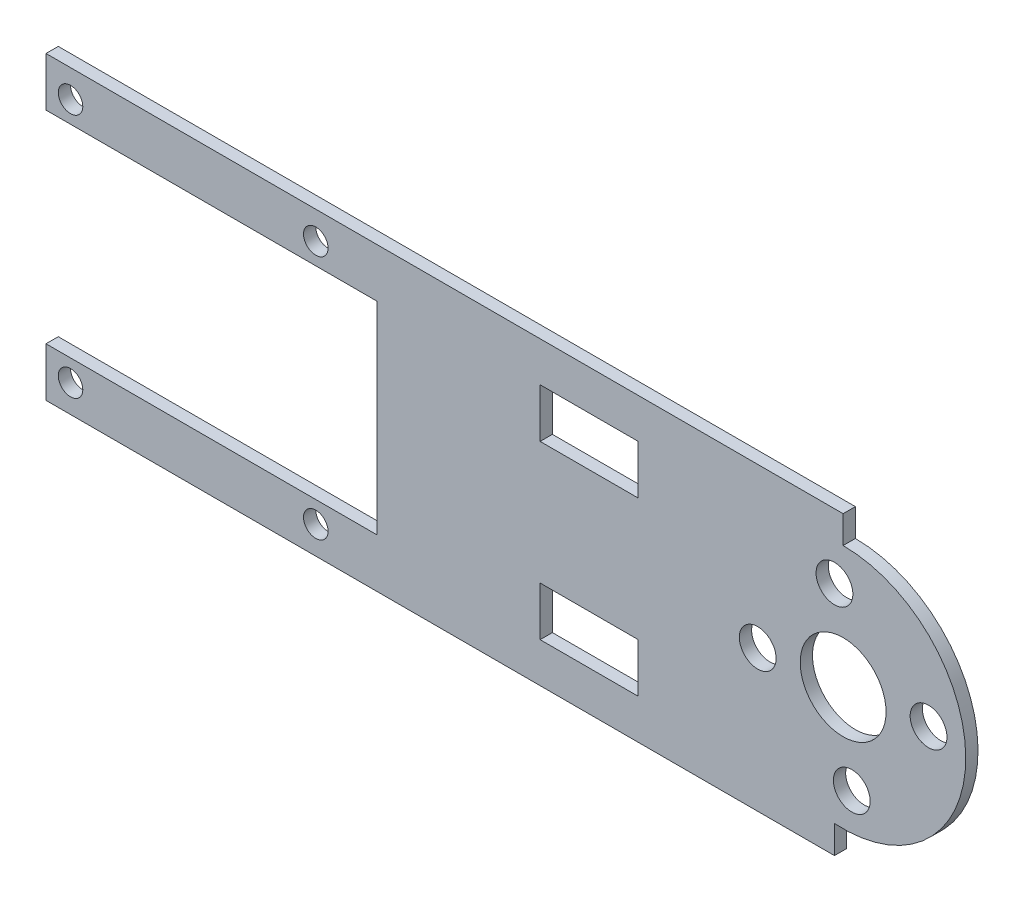
ISO-10303-21;
HEADER;
FILE_DESCRIPTION(('STEP AP214'),'2;1');
FILE_NAME('part.step','',(''),(''),'','','');
FILE_SCHEMA(('AUTOMOTIVE_DESIGN { 1 0 10303 214 1 1 1 1 }'));
ENDSEC;
DATA;
#1=APPLICATION_CONTEXT('core data for automotive mechanical design processes');
#2=APPLICATION_PROTOCOL_DEFINITION('international standard','automotive_design',2000,#1);
#3=PRODUCT_CONTEXT('',#1,'mechanical');
#4=PRODUCT('Part','Part','',(#3));
#5=PRODUCT_RELATED_PRODUCT_CATEGORY('part','',(#4));
#6=PRODUCT_DEFINITION_FORMATION('','',#4);
#7=PRODUCT_DEFINITION_CONTEXT('part definition',#1,'design');
#8=PRODUCT_DEFINITION('design','',#6,#7);
#9=PRODUCT_DEFINITION_SHAPE('','',#8);
#10=(LENGTH_UNIT() NAMED_UNIT(*) SI_UNIT(.MILLI.,.METRE.));
#11=(NAMED_UNIT(*) PLANE_ANGLE_UNIT() SI_UNIT($,.RADIAN.));
#12=(NAMED_UNIT(*) SI_UNIT($,.STERADIAN.) SOLID_ANGLE_UNIT());
#13=UNCERTAINTY_MEASURE_WITH_UNIT(LENGTH_MEASURE(1.E-05),#10,'distance_accuracy_value','');
#14=(GEOMETRIC_REPRESENTATION_CONTEXT(3) GLOBAL_UNCERTAINTY_ASSIGNED_CONTEXT((#13)) GLOBAL_UNIT_ASSIGNED_CONTEXT((#10,
#11,#12)) REPRESENTATION_CONTEXT('',''));
#15=CARTESIAN_POINT('',(0.,0.,0.));
#16=DIRECTION('',(0.,0.,1.));
#17=DIRECTION('',(1.,0.,0.));
#18=AXIS2_PLACEMENT_3D('',#15,#16,#17);
#19=CARTESIAN_POINT('',(40.873321990121,0.,1.));
#20=DIRECTION('',(0.,0.,1.));
#21=DIRECTION('',(1.,0.,0.));
#22=AXIS2_PLACEMENT_3D('',#19,#20,#21);
#23=PLANE('',#22);
#24=CARTESIAN_POINT('',(41.5802048961463,-6.96421686603521,1.));
#25=DIRECTION('',(0.,0.,1.));
#26=DIRECTION('',(1.,0.,0.));
#27=AXIS2_PLACEMENT_3D('',#24,#25,#26);
#28=CIRCLE('',#27,1.5);
#29=CARTESIAN_POINT('',(43.0802048961463,-6.96421686603521,1.));
#30=VERTEX_POINT('',#29);
#31=EDGE_CURVE('E230',#30,#30,#28,.T.);
#32=ORIENTED_EDGE('',*,*,#31,.F.);
#33=EDGE_LOOP('',(#32));
#34=FACE_BOUND('',#33,.T.);
#35=DIRECTION('',(-1.,0.,0.));
#36=VECTOR('',#35,1.);
#37=CARTESIAN_POINT('',(16.1664710949383,9.,1.));
#38=LINE('',#37,#36);
#39=CARTESIAN_POINT('',(24.1664710949383,9.,1.));
#40=VERTEX_POINT('',#39);
#41=CARTESIAN_POINT('',(16.1664710949383,9.,1.));
#42=VERTEX_POINT('',#41);
#43=EDGE_CURVE('E246',#40,#42,#38,.T.);
#44=ORIENTED_EDGE('',*,*,#43,.F.);
#45=DIRECTION('',(0.,1.,0.));
#46=VECTOR('',#45,1.);
#47=CARTESIAN_POINT('',(24.1664710949383,9.,1.));
#48=LINE('',#47,#46);
#49=CARTESIAN_POINT('',(24.1664710949383,5.,1.));
#50=VERTEX_POINT('',#49);
#51=EDGE_CURVE('E244',#50,#40,#48,.T.);
#52=ORIENTED_EDGE('',*,*,#51,.F.);
#53=DIRECTION('',(1.,0.,0.));
#54=VECTOR('',#53,1.);
#55=CARTESIAN_POINT('',(16.1664710949383,5.,1.));
#56=LINE('',#55,#54);
#57=CARTESIAN_POINT('',(16.1664710949383,5.,1.));
#58=VERTEX_POINT('',#57);
#59=EDGE_CURVE('E255',#58,#50,#56,.T.);
#60=ORIENTED_EDGE('',*,*,#59,.F.);
#61=DIRECTION('',(0.,-1.,0.));
#62=VECTOR('',#61,1.);
#63=CARTESIAN_POINT('',(16.1664710949383,9.,1.));
#64=LINE('',#63,#62);
#65=EDGE_CURVE('E249',#42,#58,#64,.T.);
#66=ORIENTED_EDGE('',*,*,#65,.F.);
#67=EDGE_LOOP('',(#44,#52,#60,#66));
#68=FACE_BOUND('',#67,.T.);
#69=CARTESIAN_POINT('',(40.1664390840958,6.96421686603521,1.));
#70=DIRECTION('',(0.,0.,1.));
#71=DIRECTION('',(1.,0.,0.));
#72=AXIS2_PLACEMENT_3D('',#69,#70,#71);
#73=CIRCLE('',#72,1.5);
#74=CARTESIAN_POINT('',(41.6664390840958,6.96421686603521,1.));
#75=VERTEX_POINT('',#74);
#76=EDGE_CURVE('E286',#75,#75,#73,.T.);
#77=ORIENTED_EDGE('',*,*,#76,.F.);
#78=EDGE_LOOP('',(#77));
#79=FACE_BOUND('',#78,.T.);
#80=CARTESIAN_POINT('',(-22.126678009879,-10.,1.));
#81=DIRECTION('',(0.,0.,1.));
#82=DIRECTION('',(1.,0.,0.));
#83=AXIS2_PLACEMENT_3D('',#80,#81,#82);
#84=CIRCLE('',#83,0.999999999999998);
#85=CARTESIAN_POINT('',(-21.126678009879,-10.,1.));
#86=VERTEX_POINT('',#85);
#87=EDGE_CURVE('E305',#86,#86,#84,.T.);
#88=ORIENTED_EDGE('',*,*,#87,.F.);
#89=EDGE_LOOP('',(#88));
#90=FACE_BOUND('',#89,.T.);
#91=CARTESIAN_POINT('',(-2.12667800987896,-10.,1.));
#92=DIRECTION('',(0.,0.,1.));
#93=DIRECTION('',(1.,0.,0.));
#94=AXIS2_PLACEMENT_3D('',#91,#92,#93);
#95=CIRCLE('',#94,1.);
#96=CARTESIAN_POINT('',(-1.12667800987896,-10.,1.));
#97=VERTEX_POINT('',#96);
#98=EDGE_CURVE('E318',#97,#97,#95,.T.);
#99=ORIENTED_EDGE('',*,*,#98,.F.);
#100=EDGE_LOOP('',(#99));
#101=FACE_BOUND('',#100,.T.);
#102=DIRECTION('',(1.,0.,0.));
#103=VECTOR('',#102,1.);
#104=CARTESIAN_POINT('',(40.1664710949383,-12.25,1.));
#105=LINE('',#104,#103);
#106=CARTESIAN_POINT('',(-24.126678009879,-12.25,1.));
#107=VERTEX_POINT('',#106);
#108=CARTESIAN_POINT('',(40.1664710949383,-12.25,1.));
#109=VERTEX_POINT('',#108);
#110=EDGE_CURVE('E331',#107,#109,#105,.T.);
#111=ORIENTED_EDGE('',*,*,#110,.T.);
#112=DIRECTION('',(0.,1.,0.));
#113=VECTOR('',#112,1.);
#114=CARTESIAN_POINT('',(40.1664710949383,-9.97498680760929,1.));
#115=LINE('',#114,#113);
#116=CARTESIAN_POINT('',(40.1664710949383,-9.97498680760929,1.));
#117=VERTEX_POINT('',#116);
#118=EDGE_CURVE('E339',#109,#117,#115,.T.);
#119=ORIENTED_EDGE('',*,*,#118,.T.);
#120=CARTESIAN_POINT('',(40.873321990121,0.,1.));
#121=DIRECTION('',(0.,0.,1.));
#122=DIRECTION('',(1.,0.,0.));
#123=AXIS2_PLACEMENT_3D('',#120,#121,#122);
#124=CIRCLE('',#123,10.);
#125=CARTESIAN_POINT('',(40.873321990121,10.,1.));
#126=VERTEX_POINT('',#125);
#127=EDGE_CURVE('E345',#117,#126,#124,.T.);
#128=ORIENTED_EDGE('',*,*,#127,.T.);
#129=DIRECTION('',(0.,1.,0.));
#130=VECTOR('',#129,1.);
#131=CARTESIAN_POINT('',(40.873321990121,12.25,1.));
#132=LINE('',#131,#130);
#133=CARTESIAN_POINT('',(40.873321990121,12.25,1.));
#134=VERTEX_POINT('',#133);
#135=EDGE_CURVE('E344',#126,#134,#132,.T.);
#136=ORIENTED_EDGE('',*,*,#135,.T.);
#137=DIRECTION('',(-1.,0.,0.));
#138=VECTOR('',#137,1.);
#139=CARTESIAN_POINT('',(5.87332199012103,12.25,1.));
#140=LINE('',#139,#138);
#141=CARTESIAN_POINT('',(-24.126678009879,12.25,1.));
#142=VERTEX_POINT('',#141);
#143=EDGE_CURVE('E346',#134,#142,#140,.T.);
#144=ORIENTED_EDGE('',*,*,#143,.T.);
#145=DIRECTION('',(0.,-1.,0.));
#146=VECTOR('',#145,1.);
#147=CARTESIAN_POINT('',(-24.126678009879,12.25,1.));
#148=LINE('',#147,#146);
#149=CARTESIAN_POINT('',(-24.126678009879,8.25,1.));
#150=VERTEX_POINT('',#149);
#151=EDGE_CURVE('E352',#142,#150,#148,.T.);
#152=ORIENTED_EDGE('',*,*,#151,.T.);
#153=DIRECTION('',(1.,0.,0.));
#154=VECTOR('',#153,1.);
#155=CARTESIAN_POINT('',(-24.126678009879,8.25,1.));
#156=LINE('',#155,#154);
#157=CARTESIAN_POINT('',(2.87332199012104,8.25,1.));
#158=VERTEX_POINT('',#157);
#159=EDGE_CURVE('E351',#150,#158,#156,.T.);
#160=ORIENTED_EDGE('',*,*,#159,.T.);
#161=DIRECTION('',(0.,-1.,0.));
#162=VECTOR('',#161,1.);
#163=CARTESIAN_POINT('',(2.87332199012104,8.25,1.));
#164=LINE('',#163,#162);
#165=CARTESIAN_POINT('',(2.87332199012104,-8.25,1.));
#166=VERTEX_POINT('',#165);
#167=EDGE_CURVE('E360',#158,#166,#164,.T.);
#168=ORIENTED_EDGE('',*,*,#167,.T.);
#169=DIRECTION('',(-1.,0.,0.));
#170=VECTOR('',#169,1.);
#171=CARTESIAN_POINT('',(2.87332199012104,-8.25,1.));
#172=LINE('',#171,#170);
#173=CARTESIAN_POINT('',(-24.126678009879,-8.25000000000001,1.));
#174=VERTEX_POINT('',#173);
#175=EDGE_CURVE('E359',#166,#174,#172,.T.);
#176=ORIENTED_EDGE('',*,*,#175,.T.);
#177=DIRECTION('',(0.,-1.,0.));
#178=VECTOR('',#177,1.);
#179=CARTESIAN_POINT('',(-24.126678009879,-8.25000000000001,1.));
#180=LINE('',#179,#178);
#181=EDGE_CURVE('E361',#174,#107,#180,.T.);
#182=ORIENTED_EDGE('',*,*,#181,.T.);
#183=EDGE_LOOP('',(#111,#119,#128,#136,#144,#152,#160,#168,#176,#182));
#184=FACE_BOUND('',#183,.T.);
#185=CARTESIAN_POINT('',(-2.12667800987896,10.,1.));
#186=DIRECTION('',(0.,0.,1.));
#187=DIRECTION('',(1.,0.,0.));
#188=AXIS2_PLACEMENT_3D('',#185,#186,#187);
#189=CIRCLE('',#188,1.);
#190=CARTESIAN_POINT('',(-1.12667800987896,10.,1.));
#191=VERTEX_POINT('',#190);
#192=EDGE_CURVE('E326',#191,#191,#189,.T.);
#193=ORIENTED_EDGE('',*,*,#192,.F.);
#194=EDGE_LOOP('',(#193));
#195=FACE_BOUND('',#194,.T.);
#196=CARTESIAN_POINT('',(-22.126678009879,10.,1.));
#197=DIRECTION('',(0.,0.,1.));
#198=DIRECTION('',(1.,0.,0.));
#199=AXIS2_PLACEMENT_3D('',#196,#197,#198);
#200=CIRCLE('',#199,0.999999999999998);
#201=CARTESIAN_POINT('',(-21.126678009879,10.,1.));
#202=VERTEX_POINT('',#201);
#203=EDGE_CURVE('E309',#202,#202,#200,.T.);
#204=ORIENTED_EDGE('',*,*,#203,.F.);
#205=EDGE_LOOP('',(#204));
#206=FACE_BOUND('',#205,.T.);
#207=CARTESIAN_POINT('',(40.873321990121,0.,1.));
#208=DIRECTION('',(0.,0.,1.));
#209=DIRECTION('',(1.,0.,0.));
#210=AXIS2_PLACEMENT_3D('',#207,#208,#209);
#211=CIRCLE('',#210,3.5);
#212=CARTESIAN_POINT('',(44.373321990121,0.,1.));
#213=VERTEX_POINT('',#212);
#214=EDGE_CURVE('E294',#213,#213,#211,.T.);
#215=ORIENTED_EDGE('',*,*,#214,.F.);
#216=EDGE_LOOP('',(#215));
#217=FACE_BOUND('',#216,.T.);
#218=CARTESIAN_POINT('',(47.8375388561562,0.706882906025226,1.));
#219=DIRECTION('',(0.,0.,1.));
#220=DIRECTION('',(1.,0.,0.));
#221=AXIS2_PLACEMENT_3D('',#218,#219,#220);
#222=CIRCLE('',#221,1.5);
#223=CARTESIAN_POINT('',(49.3375388561562,0.706882906025226,1.));
#224=VERTEX_POINT('',#223);
#225=EDGE_CURVE('E234',#224,#224,#222,.T.);
#226=ORIENTED_EDGE('',*,*,#225,.F.);
#227=EDGE_LOOP('',(#226));
#228=FACE_BOUND('',#227,.T.);
#229=CARTESIAN_POINT('',(33.9091051240858,-0.706882906025225,1.));
#230=DIRECTION('',(0.,0.,1.));
#231=DIRECTION('',(1.,0.,0.));
#232=AXIS2_PLACEMENT_3D('',#229,#230,#231);
#233=CIRCLE('',#232,1.5);
#234=CARTESIAN_POINT('',(35.4091051240858,-0.706882906025225,1.));
#235=VERTEX_POINT('',#234);
#236=EDGE_CURVE('E218',#235,#235,#233,.T.);
#237=ORIENTED_EDGE('',*,*,#236,.F.);
#238=EDGE_LOOP('',(#237));
#239=FACE_BOUND('',#238,.T.);
#240=DIRECTION('',(-1.,0.,0.));
#241=VECTOR('',#240,1.);
#242=CARTESIAN_POINT('',(16.1664710949383,-5.,1.));
#243=LINE('',#242,#241);
#244=CARTESIAN_POINT('',(24.1664710949383,-5.,1.));
#245=VERTEX_POINT('',#244);
#246=CARTESIAN_POINT('',(16.1664710949383,-5.,1.));
#247=VERTEX_POINT('',#246);
#248=EDGE_CURVE('E179',#245,#247,#243,.T.);
#249=ORIENTED_EDGE('',*,*,#248,.F.);
#250=DIRECTION('',(0.,1.,0.));
#251=VECTOR('',#250,1.);
#252=CARTESIAN_POINT('',(24.1664710949383,-5.,1.));
#253=LINE('',#252,#251);
#254=CARTESIAN_POINT('',(24.1664710949383,-9.,1.));
#255=VERTEX_POINT('',#254);
#256=EDGE_CURVE('E172',#255,#245,#253,.T.);
#257=ORIENTED_EDGE('',*,*,#256,.F.);
#258=DIRECTION('',(1.,0.,0.));
#259=VECTOR('',#258,1.);
#260=CARTESIAN_POINT('',(16.1664710949383,-9.,1.));
#261=LINE('',#260,#259);
#262=CARTESIAN_POINT('',(16.1664710949383,-9.,1.));
#263=VERTEX_POINT('',#262);
#264=EDGE_CURVE('E197',#263,#255,#261,.T.);
#265=ORIENTED_EDGE('',*,*,#264,.F.);
#266=DIRECTION('',(0.,-1.,0.));
#267=VECTOR('',#266,1.);
#268=CARTESIAN_POINT('',(16.1664710949383,-5.,1.));
#269=LINE('',#268,#267);
#270=EDGE_CURVE('E193',#247,#263,#269,.T.);
#271=ORIENTED_EDGE('',*,*,#270,.F.);
#272=EDGE_LOOP('',(#249,#257,#265,#271));
#273=FACE_BOUND('',#272,.T.);
#274=ADVANCED_FACE('F44',(#34,#68,#79,#90,#101,#184,#195,#206,#217,#228,#239,#273),#23,.T.);
#275=CARTESIAN_POINT('',(40.873321990121,0.,0.));
#276=DIRECTION('',(0.,0.,1.));
#277=DIRECTION('',(1.,0.,0.));
#278=AXIS2_PLACEMENT_3D('',#275,#276,#277);
#279=PLANE('',#278);
#280=CARTESIAN_POINT('',(33.9091051240858,-0.706882906025225,0.));
#281=DIRECTION('',(0.,0.,1.));
#282=DIRECTION('',(1.,0.,0.));
#283=AXIS2_PLACEMENT_3D('',#280,#281,#282);
#284=CIRCLE('',#283,1.5);
#285=CARTESIAN_POINT('',(35.4091051240858,-0.706882906025225,0.));
#286=VERTEX_POINT('',#285);
#287=EDGE_CURVE('E186',#286,#286,#284,.T.);
#288=ORIENTED_EDGE('',*,*,#287,.T.);
#289=EDGE_LOOP('',(#288));
#290=FACE_BOUND('',#289,.T.);
#291=CARTESIAN_POINT('',(41.5802048961463,-6.96421686603521,0.));
#292=DIRECTION('',(0.,0.,1.));
#293=DIRECTION('',(1.,0.,0.));
#294=AXIS2_PLACEMENT_3D('',#291,#292,#293);
#295=CIRCLE('',#294,1.5);
#296=CARTESIAN_POINT('',(43.0802048961463,-6.96421686603521,0.));
#297=VERTEX_POINT('',#296);
#298=EDGE_CURVE('E224',#297,#297,#295,.T.);
#299=ORIENTED_EDGE('',*,*,#298,.T.);
#300=EDGE_LOOP('',(#299));
#301=FACE_BOUND('',#300,.T.);
#302=CARTESIAN_POINT('',(47.8375388561562,0.706882906025226,0.));
#303=DIRECTION('',(0.,0.,1.));
#304=DIRECTION('',(1.,0.,0.));
#305=AXIS2_PLACEMENT_3D('',#302,#303,#304);
#306=CIRCLE('',#305,1.5);
#307=CARTESIAN_POINT('',(49.3375388561562,0.706882906025226,0.));
#308=VERTEX_POINT('',#307);
#309=EDGE_CURVE('E231',#308,#308,#306,.T.);
#310=ORIENTED_EDGE('',*,*,#309,.T.);
#311=EDGE_LOOP('',(#310));
#312=FACE_BOUND('',#311,.T.);
#313=DIRECTION('',(0.,1.,0.));
#314=VECTOR('',#313,1.);
#315=CARTESIAN_POINT('',(24.1664710949383,9.,0.));
#316=LINE('',#315,#314);
#317=CARTESIAN_POINT('',(24.1664710949383,5.,0.));
#318=VERTEX_POINT('',#317);
#319=CARTESIAN_POINT('',(24.1664710949383,9.,0.));
#320=VERTEX_POINT('',#319);
#321=EDGE_CURVE('E239',#318,#320,#316,.T.);
#322=ORIENTED_EDGE('',*,*,#321,.T.);
#323=DIRECTION('',(-1.,0.,0.));
#324=VECTOR('',#323,1.);
#325=CARTESIAN_POINT('',(16.1664710949383,9.,0.));
#326=LINE('',#325,#324);
#327=CARTESIAN_POINT('',(16.1664710949383,9.,0.));
#328=VERTEX_POINT('',#327);
#329=EDGE_CURVE('E261',#320,#328,#326,.T.);
#330=ORIENTED_EDGE('',*,*,#329,.T.);
#331=DIRECTION('',(0.,-1.,0.));
#332=VECTOR('',#331,1.);
#333=CARTESIAN_POINT('',(16.1664710949383,9.,0.));
#334=LINE('',#333,#332);
#335=CARTESIAN_POINT('',(16.1664710949383,5.,0.));
#336=VERTEX_POINT('',#335);
#337=EDGE_CURVE('E264',#328,#336,#334,.T.);
#338=ORIENTED_EDGE('',*,*,#337,.T.);
#339=DIRECTION('',(1.,0.,0.));
#340=VECTOR('',#339,1.);
#341=CARTESIAN_POINT('',(16.1664710949383,5.,0.));
#342=LINE('',#341,#340);
#343=EDGE_CURVE('E250',#336,#318,#342,.T.);
#344=ORIENTED_EDGE('',*,*,#343,.T.);
#345=EDGE_LOOP('',(#322,#330,#338,#344));
#346=FACE_BOUND('',#345,.T.);
#347=DIRECTION('',(0.,1.,0.));
#348=VECTOR('',#347,1.);
#349=CARTESIAN_POINT('',(40.1664710949383,-9.97498680760929,0.));
#350=LINE('',#349,#348);
#351=CARTESIAN_POINT('',(40.1664710949383,-12.25,0.));
#352=VERTEX_POINT('',#351);
#353=CARTESIAN_POINT('',(40.1664710949383,-9.97498680760929,0.));
#354=VERTEX_POINT('',#353);
#355=EDGE_CURVE('E329',#352,#354,#350,.T.);
#356=ORIENTED_EDGE('',*,*,#355,.F.);
#357=DIRECTION('',(1.,0.,0.));
#358=VECTOR('',#357,1.);
#359=CARTESIAN_POINT('',(-4.12667800987897,-12.25,0.));
#360=LINE('',#359,#358);
#361=CARTESIAN_POINT('',(-24.126678009879,-12.25,0.));
#362=VERTEX_POINT('',#361);
#363=EDGE_CURVE('E336',#362,#352,#360,.T.);
#364=ORIENTED_EDGE('',*,*,#363,.F.);
#365=DIRECTION('',(0.,-1.,0.));
#366=VECTOR('',#365,1.);
#367=CARTESIAN_POINT('',(-24.126678009879,-8.25000000000001,0.));
#368=LINE('',#367,#366);
#369=CARTESIAN_POINT('',(-24.126678009879,-8.25000000000001,0.));
#370=VERTEX_POINT('',#369);
#371=EDGE_CURVE('E395',#370,#362,#368,.T.);
#372=ORIENTED_EDGE('',*,*,#371,.F.);
#373=DIRECTION('',(-1.,0.,0.));
#374=VECTOR('',#373,1.);
#375=CARTESIAN_POINT('',(2.87332199012104,-8.25,0.));
#376=LINE('',#375,#374);
#377=CARTESIAN_POINT('',(2.87332199012104,-8.25,0.));
#378=VERTEX_POINT('',#377);
#379=EDGE_CURVE('E386',#378,#370,#376,.T.);
#380=ORIENTED_EDGE('',*,*,#379,.F.);
#381=DIRECTION('',(0.,-1.,0.));
#382=VECTOR('',#381,1.);
#383=CARTESIAN_POINT('',(2.87332199012104,8.25,0.));
#384=LINE('',#383,#382);
#385=CARTESIAN_POINT('',(2.87332199012104,8.25,0.));
#386=VERTEX_POINT('',#385);
#387=EDGE_CURVE('E387',#386,#378,#384,.T.);
#388=ORIENTED_EDGE('',*,*,#387,.F.);
#389=DIRECTION('',(1.,0.,0.));
#390=VECTOR('',#389,1.);
#391=CARTESIAN_POINT('',(-24.126678009879,8.25,0.));
#392=LINE('',#391,#390);
#393=CARTESIAN_POINT('',(-24.126678009879,8.25,0.));
#394=VERTEX_POINT('',#393);
#395=EDGE_CURVE('E382',#394,#386,#392,.T.);
#396=ORIENTED_EDGE('',*,*,#395,.F.);
#397=DIRECTION('',(0.,-1.,0.));
#398=VECTOR('',#397,1.);
#399=CARTESIAN_POINT('',(-24.126678009879,12.25,0.));
#400=LINE('',#399,#398);
#401=CARTESIAN_POINT('',(-24.126678009879,12.25,0.));
#402=VERTEX_POINT('',#401);
#403=EDGE_CURVE('E379',#402,#394,#400,.T.);
#404=ORIENTED_EDGE('',*,*,#403,.F.);
#405=DIRECTION('',(-1.,0.,0.));
#406=VECTOR('',#405,1.);
#407=CARTESIAN_POINT('',(-4.12667800987897,12.25,0.));
#408=LINE('',#407,#406);
#409=CARTESIAN_POINT('',(40.873321990121,12.25,0.));
#410=VERTEX_POINT('',#409);
#411=EDGE_CURVE('E380',#410,#402,#408,.T.);
#412=ORIENTED_EDGE('',*,*,#411,.F.);
#413=DIRECTION('',(0.,1.,0.));
#414=VECTOR('',#413,1.);
#415=CARTESIAN_POINT('',(40.873321990121,12.25,0.));
#416=LINE('',#415,#414);
#417=CARTESIAN_POINT('',(40.873321990121,10.,0.));
#418=VERTEX_POINT('',#417);
#419=EDGE_CURVE('E373',#418,#410,#416,.T.);
#420=ORIENTED_EDGE('',*,*,#419,.F.);
#421=CARTESIAN_POINT('',(40.873321990121,0.,0.));
#422=DIRECTION('',(0.,0.,1.));
#423=DIRECTION('',(1.,0.,0.));
#424=AXIS2_PLACEMENT_3D('',#421,#422,#423);
#425=CIRCLE('',#424,10.);
#426=EDGE_CURVE('E367',#354,#418,#425,.T.);
#427=ORIENTED_EDGE('',*,*,#426,.F.);
#428=EDGE_LOOP('',(#356,#364,#372,#380,#388,#396,#404,#412,#420,#427));
#429=FACE_BOUND('',#428,.T.);
#430=CARTESIAN_POINT('',(-2.12667800987896,10.,0.));
#431=DIRECTION('',(0.,0.,1.));
#432=DIRECTION('',(1.,0.,0.));
#433=AXIS2_PLACEMENT_3D('',#430,#431,#432);
#434=CIRCLE('',#433,1.);
#435=CARTESIAN_POINT('',(-1.12667800987896,10.,0.));
#436=VERTEX_POINT('',#435);
#437=EDGE_CURVE('E325',#436,#436,#434,.T.);
#438=ORIENTED_EDGE('',*,*,#437,.T.);
#439=EDGE_LOOP('',(#438));
#440=FACE_BOUND('',#439,.T.);
#441=CARTESIAN_POINT('',(-2.12667800987896,-10.,0.));
#442=DIRECTION('',(0.,0.,1.));
#443=DIRECTION('',(1.,0.,0.));
#444=AXIS2_PLACEMENT_3D('',#441,#442,#443);
#445=CIRCLE('',#444,1.);
#446=CARTESIAN_POINT('',(-1.12667800987896,-10.,0.));
#447=VERTEX_POINT('',#446);
#448=EDGE_CURVE('E314',#447,#447,#445,.T.);
#449=ORIENTED_EDGE('',*,*,#448,.T.);
#450=EDGE_LOOP('',(#449));
#451=FACE_BOUND('',#450,.T.);
#452=CARTESIAN_POINT('',(-22.126678009879,10.,0.));
#453=DIRECTION('',(0.,0.,1.));
#454=DIRECTION('',(1.,0.,0.));
#455=AXIS2_PLACEMENT_3D('',#452,#453,#454);
#456=CIRCLE('',#455,0.999999999999998);
#457=CARTESIAN_POINT('',(-21.126678009879,10.,0.));
#458=VERTEX_POINT('',#457);
#459=EDGE_CURVE('E308',#458,#458,#456,.T.);
#460=ORIENTED_EDGE('',*,*,#459,.T.);
#461=EDGE_LOOP('',(#460));
#462=FACE_BOUND('',#461,.T.);
#463=CARTESIAN_POINT('',(-22.126678009879,-10.,0.));
#464=DIRECTION('',(0.,0.,1.));
#465=DIRECTION('',(1.,0.,0.));
#466=AXIS2_PLACEMENT_3D('',#463,#464,#465);
#467=CIRCLE('',#466,0.999999999999998);
#468=CARTESIAN_POINT('',(-21.126678009879,-10.,0.));
#469=VERTEX_POINT('',#468);
#470=EDGE_CURVE('E299',#469,#469,#467,.T.);
#471=ORIENTED_EDGE('',*,*,#470,.T.);
#472=EDGE_LOOP('',(#471));
#473=FACE_BOUND('',#472,.T.);
#474=CARTESIAN_POINT('',(40.873321990121,0.,0.));
#475=DIRECTION('',(0.,0.,1.));
#476=DIRECTION('',(1.,0.,0.));
#477=AXIS2_PLACEMENT_3D('',#474,#475,#476);
#478=CIRCLE('',#477,3.5);
#479=CARTESIAN_POINT('',(44.373321990121,0.,0.));
#480=VERTEX_POINT('',#479);
#481=EDGE_CURVE('E289',#480,#480,#478,.T.);
#482=ORIENTED_EDGE('',*,*,#481,.T.);
#483=EDGE_LOOP('',(#482));
#484=FACE_BOUND('',#483,.T.);
#485=CARTESIAN_POINT('',(40.1664390840958,6.96421686603521,0.));
#486=DIRECTION('',(0.,0.,1.));
#487=DIRECTION('',(1.,0.,0.));
#488=AXIS2_PLACEMENT_3D('',#485,#486,#487);
#489=CIRCLE('',#488,1.5);
#490=CARTESIAN_POINT('',(41.6664390840958,6.96421686603521,0.));
#491=VERTEX_POINT('',#490);
#492=EDGE_CURVE('E283',#491,#491,#489,.T.);
#493=ORIENTED_EDGE('',*,*,#492,.T.);
#494=EDGE_LOOP('',(#493));
#495=FACE_BOUND('',#494,.T.);
#496=DIRECTION('',(0.,1.,0.));
#497=VECTOR('',#496,1.);
#498=CARTESIAN_POINT('',(24.1664710949383,-5.,0.));
#499=LINE('',#498,#497);
#500=CARTESIAN_POINT('',(24.1664710949383,-9.,0.));
#501=VERTEX_POINT('',#500);
#502=CARTESIAN_POINT('',(24.1664710949383,-5.,0.));
#503=VERTEX_POINT('',#502);
#504=EDGE_CURVE('E67',#501,#503,#499,.T.);
#505=ORIENTED_EDGE('',*,*,#504,.T.);
#506=DIRECTION('',(-1.,0.,0.));
#507=VECTOR('',#506,1.);
#508=CARTESIAN_POINT('',(16.1664710949383,-5.,0.));
#509=LINE('',#508,#507);
#510=CARTESIAN_POINT('',(16.1664710949383,-5.,0.));
#511=VERTEX_POINT('',#510);
#512=EDGE_CURVE('E190',#503,#511,#509,.T.);
#513=ORIENTED_EDGE('',*,*,#512,.T.);
#514=DIRECTION('',(0.,-1.,0.));
#515=VECTOR('',#514,1.);
#516=CARTESIAN_POINT('',(16.1664710949383,-5.,0.));
#517=LINE('',#516,#515);
#518=CARTESIAN_POINT('',(16.1664710949383,-9.,0.));
#519=VERTEX_POINT('',#518);
#520=EDGE_CURVE('E206',#511,#519,#517,.T.);
#521=ORIENTED_EDGE('',*,*,#520,.T.);
#522=DIRECTION('',(1.,0.,0.));
#523=VECTOR('',#522,1.);
#524=CARTESIAN_POINT('',(16.1664710949383,-9.,0.));
#525=LINE('',#524,#523);
#526=EDGE_CURVE('E182',#519,#501,#525,.T.);
#527=ORIENTED_EDGE('',*,*,#526,.T.);
#528=EDGE_LOOP('',(#505,#513,#521,#527));
#529=FACE_BOUND('',#528,.T.);
#530=ADVANCED_FACE('F439',(#290,#301,#312,#346,#429,#440,#451,#462,#473,#484,#495,#529),#279,.F.);
#531=CARTESIAN_POINT('',(40.1664710949383,-9.97498680760929,1.));
#532=DIRECTION('',(-1.,0.,0.));
#533=DIRECTION('',(0.,-1.,0.));
#534=AXIS2_PLACEMENT_3D('',#531,#532,#533);
#535=PLANE('',#534);
#536=ORIENTED_EDGE('',*,*,#355,.T.);
#537=DIRECTION('',(0.,0.,-1.));
#538=VECTOR('',#537,1.);
#539=CARTESIAN_POINT('',(40.1664710949383,-9.97498680760929,1.));
#540=LINE('',#539,#538);
#541=EDGE_CURVE('E53',#117,#354,#540,.T.);
#542=ORIENTED_EDGE('',*,*,#541,.F.);
#543=ORIENTED_EDGE('',*,*,#118,.F.);
#544=DIRECTION('',(0.,0.,-1.));
#545=VECTOR('',#544,1.);
#546=CARTESIAN_POINT('',(40.1664710949383,-12.25,1.));
#547=LINE('',#546,#545);
#548=EDGE_CURVE('E11',#109,#352,#547,.T.);
#549=ORIENTED_EDGE('',*,*,#548,.T.);
#550=EDGE_LOOP('',(#536,#542,#543,#549));
#551=FACE_BOUND('',#550,.T.);
#552=ADVANCED_FACE('F50',(#551),#535,.F.);
#553=CARTESIAN_POINT('',(40.873321990121,0.,1.));
#554=DIRECTION('',(0.,0.,-1.));
#555=DIRECTION('',(-1.,0.,0.));
#556=AXIS2_PLACEMENT_3D('',#553,#554,#555);
#557=CYLINDRICAL_SURFACE('',#556,10.);
#558=ORIENTED_EDGE('',*,*,#426,.T.);
#559=DIRECTION('',(0.,0.,-1.));
#560=VECTOR('',#559,1.);
#561=CARTESIAN_POINT('',(40.873321990121,10.,1.));
#562=LINE('',#561,#560);
#563=EDGE_CURVE('E422',#126,#418,#562,.T.);
#564=ORIENTED_EDGE('',*,*,#563,.F.);
#565=ORIENTED_EDGE('',*,*,#127,.F.);
#566=ORIENTED_EDGE('',*,*,#541,.T.);
#567=EDGE_LOOP('',(#558,#564,#565,#566));
#568=FACE_BOUND('',#567,.T.);
#569=ADVANCED_FACE('F432',(#568),#557,.T.);
#570=CARTESIAN_POINT('',(40.873321990121,12.25,1.));
#571=DIRECTION('',(-1.,0.,0.));
#572=DIRECTION('',(0.,0.,1.));
#573=AXIS2_PLACEMENT_3D('',#570,#571,#572);
#574=PLANE('',#573);
#575=ORIENTED_EDGE('',*,*,#419,.T.);
#576=DIRECTION('',(0.,0.,-1.));
#577=VECTOR('',#576,1.);
#578=CARTESIAN_POINT('',(40.873321990121,12.25,1.));
#579=LINE('',#578,#577);
#580=EDGE_CURVE('E423',#134,#410,#579,.T.);
#581=ORIENTED_EDGE('',*,*,#580,.F.);
#582=ORIENTED_EDGE('',*,*,#135,.F.);
#583=ORIENTED_EDGE('',*,*,#563,.T.);
#584=EDGE_LOOP('',(#575,#581,#582,#583));
#585=FACE_BOUND('',#584,.T.);
#586=ADVANCED_FACE('F443',(#585),#574,.F.);
#587=CARTESIAN_POINT('',(-4.12667800987897,12.25,1.));
#588=DIRECTION('',(0.,-1.,0.));
#589=DIRECTION('',(1.,0.,0.));
#590=AXIS2_PLACEMENT_3D('',#587,#588,#589);
#591=PLANE('',#590);
#592=ORIENTED_EDGE('',*,*,#411,.T.);
#593=DIRECTION('',(0.,0.,-1.));
#594=VECTOR('',#593,1.);
#595=CARTESIAN_POINT('',(-24.126678009879,12.25,1.));
#596=LINE('',#595,#594);
#597=EDGE_CURVE('E417',#142,#402,#596,.T.);
#598=ORIENTED_EDGE('',*,*,#597,.F.);
#599=ORIENTED_EDGE('',*,*,#143,.F.);
#600=ORIENTED_EDGE('',*,*,#580,.T.);
#601=EDGE_LOOP('',(#592,#598,#599,#600));
#602=FACE_BOUND('',#601,.T.);
#603=ADVANCED_FACE('F446',(#602),#591,.F.);
#604=CARTESIAN_POINT('',(-24.126678009879,12.25,1.));
#605=DIRECTION('',(1.,0.,0.));
#606=DIRECTION('',(0.,0.,-1.));
#607=AXIS2_PLACEMENT_3D('',#604,#605,#606);
#608=PLANE('',#607);
#609=ORIENTED_EDGE('',*,*,#403,.T.);
#610=DIRECTION('',(0.,0.,-1.));
#611=VECTOR('',#610,1.);
#612=CARTESIAN_POINT('',(-24.126678009879,8.25,1.));
#613=LINE('',#612,#611);
#614=EDGE_CURVE('E413',#150,#394,#613,.T.);
#615=ORIENTED_EDGE('',*,*,#614,.F.);
#616=ORIENTED_EDGE('',*,*,#151,.F.);
#617=ORIENTED_EDGE('',*,*,#597,.T.);
#618=EDGE_LOOP('',(#609,#615,#616,#617));
#619=FACE_BOUND('',#618,.T.);
#620=ADVANCED_FACE('F479',(#619),#608,.F.);
#621=CARTESIAN_POINT('',(-24.126678009879,8.25,1.));
#622=DIRECTION('',(0.,1.,0.));
#623=DIRECTION('',(0.,0.,1.));
#624=AXIS2_PLACEMENT_3D('',#621,#622,#623);
#625=PLANE('',#624);
#626=ORIENTED_EDGE('',*,*,#395,.T.);
#627=DIRECTION('',(0.,0.,-1.));
#628=VECTOR('',#627,1.);
#629=CARTESIAN_POINT('',(2.87332199012104,8.25,1.));
#630=LINE('',#629,#628);
#631=EDGE_CURVE('E406',#158,#386,#630,.T.);
#632=ORIENTED_EDGE('',*,*,#631,.F.);
#633=ORIENTED_EDGE('',*,*,#159,.F.);
#634=ORIENTED_EDGE('',*,*,#614,.T.);
#635=EDGE_LOOP('',(#626,#632,#633,#634));
#636=FACE_BOUND('',#635,.T.);
#637=ADVANCED_FACE('F480',(#636),#625,.F.);
#638=CARTESIAN_POINT('',(2.87332199012104,8.25,1.));
#639=DIRECTION('',(1.,0.,0.));
#640=DIRECTION('',(0.,1.,0.));
#641=AXIS2_PLACEMENT_3D('',#638,#639,#640);
#642=PLANE('',#641);
#643=ORIENTED_EDGE('',*,*,#387,.T.);
#644=DIRECTION('',(0.,0.,-1.));
#645=VECTOR('',#644,1.);
#646=CARTESIAN_POINT('',(2.87332199012104,-8.25,1.));
#647=LINE('',#646,#645);
#648=EDGE_CURVE('E403',#166,#378,#647,.T.);
#649=ORIENTED_EDGE('',*,*,#648,.F.);
#650=ORIENTED_EDGE('',*,*,#167,.F.);
#651=ORIENTED_EDGE('',*,*,#631,.T.);
#652=EDGE_LOOP('',(#643,#649,#650,#651));
#653=FACE_BOUND('',#652,.T.);
#654=ADVANCED_FACE('F472',(#653),#642,.F.);
#655=CARTESIAN_POINT('',(2.87332199012104,-8.25,1.));
#656=DIRECTION('',(0.,-1.,0.));
#657=DIRECTION('',(1.,0.,0.));
#658=AXIS2_PLACEMENT_3D('',#655,#656,#657);
#659=PLANE('',#658);
#660=ORIENTED_EDGE('',*,*,#379,.T.);
#661=DIRECTION('',(0.,0.,-1.));
#662=VECTOR('',#661,1.);
#663=CARTESIAN_POINT('',(-24.126678009879,-8.25000000000001,1.));
#664=LINE('',#663,#662);
#665=EDGE_CURVE('E402',#174,#370,#664,.T.);
#666=ORIENTED_EDGE('',*,*,#665,.F.);
#667=ORIENTED_EDGE('',*,*,#175,.F.);
#668=ORIENTED_EDGE('',*,*,#648,.T.);
#669=EDGE_LOOP('',(#660,#666,#667,#668));
#670=FACE_BOUND('',#669,.T.);
#671=ADVANCED_FACE('F470',(#670),#659,.F.);
#672=CARTESIAN_POINT('',(-24.126678009879,-8.25000000000001,1.));
#673=DIRECTION('',(1.,0.,0.));
#674=DIRECTION('',(0.,0.,-1.));
#675=AXIS2_PLACEMENT_3D('',#672,#673,#674);
#676=PLANE('',#675);
#677=ORIENTED_EDGE('',*,*,#371,.T.);
#678=DIRECTION('',(0.,0.,-1.));
#679=VECTOR('',#678,1.);
#680=CARTESIAN_POINT('',(-24.126678009879,-12.25,1.));
#681=LINE('',#680,#679);
#682=EDGE_CURVE('E370',#107,#362,#681,.T.);
#683=ORIENTED_EDGE('',*,*,#682,.F.);
#684=ORIENTED_EDGE('',*,*,#181,.F.);
#685=ORIENTED_EDGE('',*,*,#665,.T.);
#686=EDGE_LOOP('',(#677,#683,#684,#685));
#687=FACE_BOUND('',#686,.T.);
#688=ADVANCED_FACE('F465',(#687),#676,.F.);
#689=CARTESIAN_POINT('',(-4.12667800987897,-12.25,1.));
#690=DIRECTION('',(0.,1.,0.));
#691=DIRECTION('',(-1.,0.,0.));
#692=AXIS2_PLACEMENT_3D('',#689,#690,#691);
#693=PLANE('',#692);
#694=ORIENTED_EDGE('',*,*,#363,.T.);
#695=ORIENTED_EDGE('',*,*,#548,.F.);
#696=ORIENTED_EDGE('',*,*,#110,.F.);
#697=ORIENTED_EDGE('',*,*,#682,.T.);
#698=EDGE_LOOP('',(#694,#695,#696,#697));
#699=FACE_BOUND('',#698,.T.);
#700=ADVANCED_FACE('F460',(#699),#693,.F.);
#701=CARTESIAN_POINT('',(-2.12667800987896,10.,1.));
#702=DIRECTION('',(0.,0.,-1.));
#703=DIRECTION('',(-1.,0.,0.));
#704=AXIS2_PLACEMENT_3D('',#701,#702,#703);
#705=CYLINDRICAL_SURFACE('',#704,1.);
#706=ORIENTED_EDGE('',*,*,#192,.T.);
#707=EDGE_LOOP('',(#706));
#708=FACE_BOUND('',#707,.T.);
#709=ORIENTED_EDGE('',*,*,#437,.F.);
#710=EDGE_LOOP('',(#709));
#711=FACE_BOUND('',#710,.T.);
#712=ADVANCED_FACE('F496',(#708,#711),#705,.F.);
#713=CARTESIAN_POINT('',(-2.12667800987896,-10.,1.));
#714=DIRECTION('',(0.,0.,-1.));
#715=DIRECTION('',(-1.,0.,0.));
#716=AXIS2_PLACEMENT_3D('',#713,#714,#715);
#717=CYLINDRICAL_SURFACE('',#716,1.);
#718=ORIENTED_EDGE('',*,*,#98,.T.);
#719=EDGE_LOOP('',(#718));
#720=FACE_BOUND('',#719,.T.);
#721=ORIENTED_EDGE('',*,*,#448,.F.);
#722=EDGE_LOOP('',(#721));
#723=FACE_BOUND('',#722,.T.);
#724=ADVANCED_FACE('F536',(#720,#723),#717,.F.);
#725=CARTESIAN_POINT('',(-22.126678009879,10.,1.));
#726=DIRECTION('',(0.,0.,-1.));
#727=DIRECTION('',(-1.,0.,0.));
#728=AXIS2_PLACEMENT_3D('',#725,#726,#727);
#729=CYLINDRICAL_SURFACE('',#728,0.999999999999998);
#730=ORIENTED_EDGE('',*,*,#203,.T.);
#731=EDGE_LOOP('',(#730));
#732=FACE_BOUND('',#731,.T.);
#733=ORIENTED_EDGE('',*,*,#459,.F.);
#734=EDGE_LOOP('',(#733));
#735=FACE_BOUND('',#734,.T.);
#736=ADVANCED_FACE('F542',(#732,#735),#729,.F.);
#737=CARTESIAN_POINT('',(-22.126678009879,-10.,1.));
#738=DIRECTION('',(0.,0.,-1.));
#739=DIRECTION('',(-1.,0.,0.));
#740=AXIS2_PLACEMENT_3D('',#737,#738,#739);
#741=CYLINDRICAL_SURFACE('',#740,0.999999999999998);
#742=ORIENTED_EDGE('',*,*,#87,.T.);
#743=EDGE_LOOP('',(#742));
#744=FACE_BOUND('',#743,.T.);
#745=ORIENTED_EDGE('',*,*,#470,.F.);
#746=EDGE_LOOP('',(#745));
#747=FACE_BOUND('',#746,.T.);
#748=ADVANCED_FACE('F555',(#744,#747),#741,.F.);
#749=CARTESIAN_POINT('',(40.873321990121,0.,1.));
#750=DIRECTION('',(0.,0.,-1.));
#751=DIRECTION('',(-1.,0.,0.));
#752=AXIS2_PLACEMENT_3D('',#749,#750,#751);
#753=CYLINDRICAL_SURFACE('',#752,3.5);
#754=ORIENTED_EDGE('',*,*,#214,.T.);
#755=EDGE_LOOP('',(#754));
#756=FACE_BOUND('',#755,.T.);
#757=ORIENTED_EDGE('',*,*,#481,.F.);
#758=EDGE_LOOP('',(#757));
#759=FACE_BOUND('',#758,.T.);
#760=ADVANCED_FACE('F561',(#756,#759),#753,.F.);
#761=CARTESIAN_POINT('',(40.1664390840958,6.96421686603521,1.));
#762=DIRECTION('',(0.,0.,-1.));
#763=DIRECTION('',(-1.,0.,0.));
#764=AXIS2_PLACEMENT_3D('',#761,#762,#763);
#765=CYLINDRICAL_SURFACE('',#764,1.5);
#766=ORIENTED_EDGE('',*,*,#76,.T.);
#767=EDGE_LOOP('',(#766));
#768=FACE_BOUND('',#767,.T.);
#769=ORIENTED_EDGE('',*,*,#492,.F.);
#770=EDGE_LOOP('',(#769));
#771=FACE_BOUND('',#770,.T.);
#772=ADVANCED_FACE('F568',(#768,#771),#765,.F.);
#773=CARTESIAN_POINT('',(24.1664710949383,9.,1.));
#774=DIRECTION('',(-1.,0.,0.));
#775=DIRECTION('',(0.,-1.,0.));
#776=AXIS2_PLACEMENT_3D('',#773,#774,#775);
#777=PLANE('',#776);
#778=ORIENTED_EDGE('',*,*,#321,.F.);
#779=DIRECTION('',(0.,0.,-1.));
#780=VECTOR('',#779,1.);
#781=CARTESIAN_POINT('',(24.1664710949383,5.,1.));
#782=LINE('',#781,#780);
#783=EDGE_CURVE('E260',#50,#318,#782,.T.);
#784=ORIENTED_EDGE('',*,*,#783,.F.);
#785=ORIENTED_EDGE('',*,*,#51,.T.);
#786=DIRECTION('',(0.,0.,-1.));
#787=VECTOR('',#786,1.);
#788=CARTESIAN_POINT('',(24.1664710949383,9.,1.));
#789=LINE('',#788,#787);
#790=EDGE_CURVE('E282',#40,#320,#789,.T.);
#791=ORIENTED_EDGE('',*,*,#790,.T.);
#792=EDGE_LOOP('',(#778,#784,#785,#791));
#793=FACE_BOUND('',#792,.T.);
#794=ADVANCED_FACE('F577',(#793),#777,.T.);
#795=CARTESIAN_POINT('',(16.1664710949383,9.,1.));
#796=DIRECTION('',(0.,-1.,0.));
#797=DIRECTION('',(0.,0.,-1.));
#798=AXIS2_PLACEMENT_3D('',#795,#796,#797);
#799=PLANE('',#798);
#800=ORIENTED_EDGE('',*,*,#329,.F.);
#801=ORIENTED_EDGE('',*,*,#790,.F.);
#802=ORIENTED_EDGE('',*,*,#43,.T.);
#803=DIRECTION('',(0.,0.,-1.));
#804=VECTOR('',#803,1.);
#805=CARTESIAN_POINT('',(16.1664710949383,9.,1.));
#806=LINE('',#805,#804);
#807=EDGE_CURVE('E279',#42,#328,#806,.T.);
#808=ORIENTED_EDGE('',*,*,#807,.T.);
#809=EDGE_LOOP('',(#800,#801,#802,#808));
#810=FACE_BOUND('',#809,.T.);
#811=ADVANCED_FACE('F586',(#810),#799,.T.);
#812=CARTESIAN_POINT('',(16.1664710949383,9.,1.));
#813=DIRECTION('',(1.,0.,0.));
#814=DIRECTION('',(0.,0.,-1.));
#815=AXIS2_PLACEMENT_3D('',#812,#813,#814);
#816=PLANE('',#815);
#817=ORIENTED_EDGE('',*,*,#337,.F.);
#818=ORIENTED_EDGE('',*,*,#807,.F.);
#819=ORIENTED_EDGE('',*,*,#65,.T.);
#820=DIRECTION('',(0.,0.,-1.));
#821=VECTOR('',#820,1.);
#822=CARTESIAN_POINT('',(16.1664710949383,5.,1.));
#823=LINE('',#822,#821);
#824=EDGE_CURVE('E274',#58,#336,#823,.T.);
#825=ORIENTED_EDGE('',*,*,#824,.T.);
#826=EDGE_LOOP('',(#817,#818,#819,#825));
#827=FACE_BOUND('',#826,.T.);
#828=ADVANCED_FACE('F600',(#827),#816,.T.);
#829=CARTESIAN_POINT('',(16.1664710949383,5.,1.));
#830=DIRECTION('',(0.,1.,0.));
#831=DIRECTION('',(-1.,0.,0.));
#832=AXIS2_PLACEMENT_3D('',#829,#830,#831);
#833=PLANE('',#832);
#834=ORIENTED_EDGE('',*,*,#343,.F.);
#835=ORIENTED_EDGE('',*,*,#824,.F.);
#836=ORIENTED_EDGE('',*,*,#59,.T.);
#837=ORIENTED_EDGE('',*,*,#783,.T.);
#838=EDGE_LOOP('',(#834,#835,#836,#837));
#839=FACE_BOUND('',#838,.T.);
#840=ADVANCED_FACE('F607',(#839),#833,.T.);
#841=CARTESIAN_POINT('',(47.8375388561562,0.706882906025226,1.));
#842=DIRECTION('',(0.,0.,-1.));
#843=DIRECTION('',(-1.,0.,0.));
#844=AXIS2_PLACEMENT_3D('',#841,#842,#843);
#845=CYLINDRICAL_SURFACE('',#844,1.5);
#846=ORIENTED_EDGE('',*,*,#225,.T.);
#847=EDGE_LOOP('',(#846));
#848=FACE_BOUND('',#847,.T.);
#849=ORIENTED_EDGE('',*,*,#309,.F.);
#850=EDGE_LOOP('',(#849));
#851=FACE_BOUND('',#850,.T.);
#852=ADVANCED_FACE('F613',(#848,#851),#845,.F.);
#853=CARTESIAN_POINT('',(41.5802048961463,-6.96421686603521,1.));
#854=DIRECTION('',(0.,0.,-1.));
#855=DIRECTION('',(-1.,0.,0.));
#856=AXIS2_PLACEMENT_3D('',#853,#854,#855);
#857=CYLINDRICAL_SURFACE('',#856,1.5);
#858=ORIENTED_EDGE('',*,*,#31,.T.);
#859=EDGE_LOOP('',(#858));
#860=FACE_BOUND('',#859,.T.);
#861=ORIENTED_EDGE('',*,*,#298,.F.);
#862=EDGE_LOOP('',(#861));
#863=FACE_BOUND('',#862,.T.);
#864=ADVANCED_FACE('F624',(#860,#863),#857,.F.);
#865=CARTESIAN_POINT('',(33.9091051240858,-0.706882906025225,1.));
#866=DIRECTION('',(0.,0.,-1.));
#867=DIRECTION('',(-1.,0.,0.));
#868=AXIS2_PLACEMENT_3D('',#865,#866,#867);
#869=CYLINDRICAL_SURFACE('',#868,1.5);
#870=ORIENTED_EDGE('',*,*,#236,.T.);
#871=EDGE_LOOP('',(#870));
#872=FACE_BOUND('',#871,.T.);
#873=ORIENTED_EDGE('',*,*,#287,.F.);
#874=EDGE_LOOP('',(#873));
#875=FACE_BOUND('',#874,.T.);
#876=ADVANCED_FACE('F633',(#872,#875),#869,.F.);
#877=CARTESIAN_POINT('',(24.1664710949383,-5.,1.));
#878=DIRECTION('',(-1.,0.,0.));
#879=DIRECTION('',(0.,-1.,0.));
#880=AXIS2_PLACEMENT_3D('',#877,#878,#879);
#881=PLANE('',#880);
#882=ORIENTED_EDGE('',*,*,#504,.F.);
#883=DIRECTION('',(0.,0.,-1.));
#884=VECTOR('',#883,1.);
#885=CARTESIAN_POINT('',(24.1664710949383,-9.,1.));
#886=LINE('',#885,#884);
#887=EDGE_CURVE('E173',#255,#501,#886,.T.);
#888=ORIENTED_EDGE('',*,*,#887,.F.);
#889=ORIENTED_EDGE('',*,*,#256,.T.);
#890=DIRECTION('',(0.,0.,-1.));
#891=VECTOR('',#890,1.);
#892=CARTESIAN_POINT('',(24.1664710949383,-5.,1.));
#893=LINE('',#892,#891);
#894=EDGE_CURVE('E171',#245,#503,#893,.T.);
#895=ORIENTED_EDGE('',*,*,#894,.T.);
#896=EDGE_LOOP('',(#882,#888,#889,#895));
#897=FACE_BOUND('',#896,.T.);
#898=ADVANCED_FACE('F174',(#897),#881,.T.);
#899=CARTESIAN_POINT('',(16.1664710949383,-5.,1.));
#900=DIRECTION('',(0.,-1.,0.));
#901=DIRECTION('',(1.,0.,0.));
#902=AXIS2_PLACEMENT_3D('',#899,#900,#901);
#903=PLANE('',#902);
#904=ORIENTED_EDGE('',*,*,#512,.F.);
#905=ORIENTED_EDGE('',*,*,#894,.F.);
#906=ORIENTED_EDGE('',*,*,#248,.T.);
#907=DIRECTION('',(0.,0.,-1.));
#908=VECTOR('',#907,1.);
#909=CARTESIAN_POINT('',(16.1664710949383,-5.,1.));
#910=LINE('',#909,#908);
#911=EDGE_CURVE('E188',#247,#511,#910,.T.);
#912=ORIENTED_EDGE('',*,*,#911,.T.);
#913=EDGE_LOOP('',(#904,#905,#906,#912));
#914=FACE_BOUND('',#913,.T.);
#915=ADVANCED_FACE('F184',(#914),#903,.T.);
#916=CARTESIAN_POINT('',(16.1664710949383,-5.,1.));
#917=DIRECTION('',(1.,0.,0.));
#918=DIRECTION('',(0.,0.,-1.));
#919=AXIS2_PLACEMENT_3D('',#916,#917,#918);
#920=PLANE('',#919);
#921=ORIENTED_EDGE('',*,*,#520,.F.);
#922=ORIENTED_EDGE('',*,*,#911,.F.);
#923=ORIENTED_EDGE('',*,*,#270,.T.);
#924=DIRECTION('',(0.,0.,-1.));
#925=VECTOR('',#924,1.);
#926=CARTESIAN_POINT('',(16.1664710949383,-9.,1.));
#927=LINE('',#926,#925);
#928=EDGE_CURVE('E62',#263,#519,#927,.T.);
#929=ORIENTED_EDGE('',*,*,#928,.T.);
#930=EDGE_LOOP('',(#921,#922,#923,#929));
#931=FACE_BOUND('',#930,.T.);
#932=ADVANCED_FACE('F660',(#931),#920,.T.);
#933=CARTESIAN_POINT('',(16.1664710949383,-9.,1.));
#934=DIRECTION('',(0.,1.,0.));
#935=DIRECTION('',(0.,0.,1.));
#936=AXIS2_PLACEMENT_3D('',#933,#934,#935);
#937=PLANE('',#936);
#938=ORIENTED_EDGE('',*,*,#526,.F.);
#939=ORIENTED_EDGE('',*,*,#928,.F.);
#940=ORIENTED_EDGE('',*,*,#264,.T.);
#941=ORIENTED_EDGE('',*,*,#887,.T.);
#942=EDGE_LOOP('',(#938,#939,#940,#941));
#943=FACE_BOUND('',#942,.T.);
#944=ADVANCED_FACE('F663',(#943),#937,.T.);
#945=CLOSED_SHELL('',(#274,#530,#552,#569,#586,#603,#620,#637,#654,#671,#688,#700,#712,#724,
#736,#748,#760,#772,#794,#811,#828,#840,#852,#864,#876,#898,#915,#932,#944));
#946=MANIFOLD_SOLID_BREP('B2',#945);
#947=ADVANCED_BREP_SHAPE_REPRESENTATION('',(#18,#946),#14);
#948=SHAPE_DEFINITION_REPRESENTATION(#9,#947);
ENDSEC;
END-ISO-10303-21;
